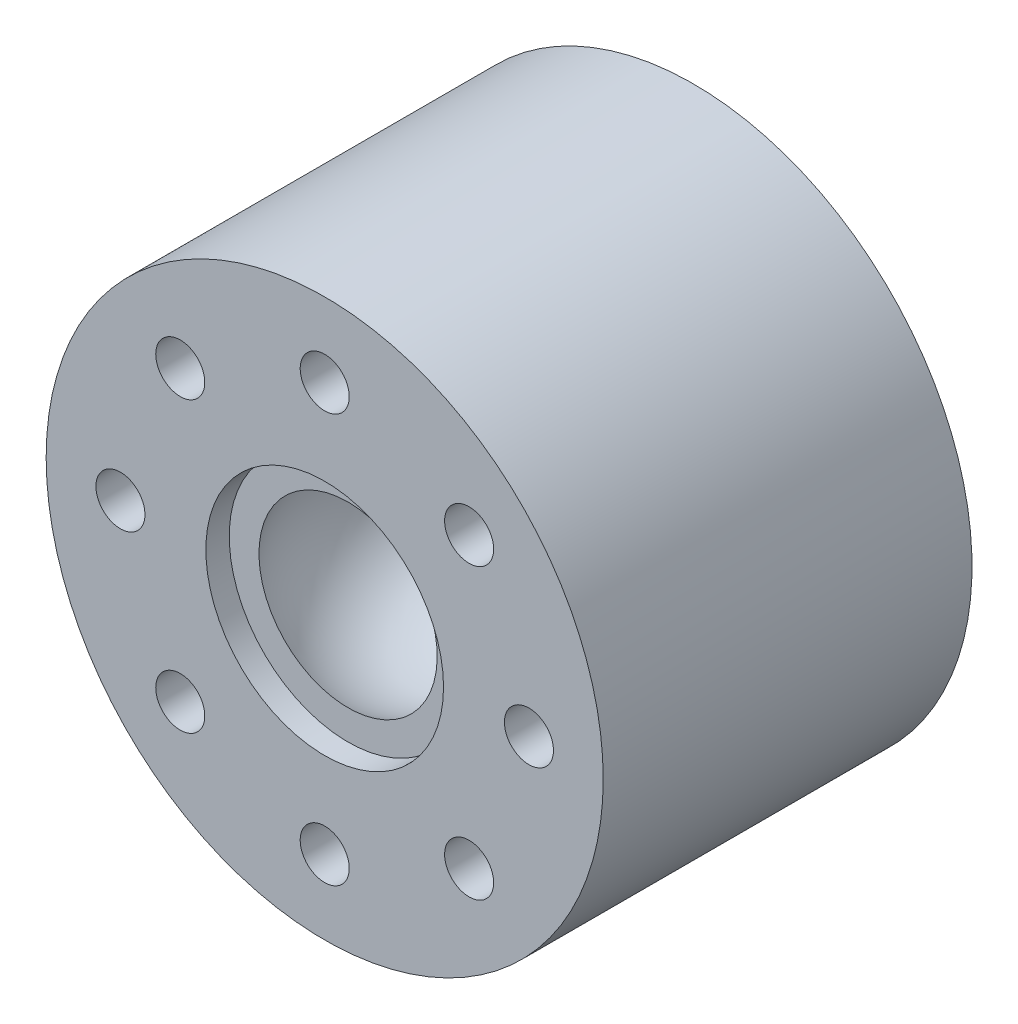
ISO-10303-21;
HEADER;
FILE_DESCRIPTION(('STEP AP214'),'2;1');
FILE_NAME('part.step','',(''),(''),'','','');
FILE_SCHEMA(('AUTOMOTIVE_DESIGN { 1 0 10303 214 1 1 1 1 }'));
ENDSEC;
DATA;
#1=APPLICATION_CONTEXT('core data for automotive mechanical design processes');
#2=APPLICATION_PROTOCOL_DEFINITION('international standard','automotive_design',2000,#1);
#3=PRODUCT_CONTEXT('',#1,'mechanical');
#4=PRODUCT('Part','Part','',(#3));
#5=PRODUCT_RELATED_PRODUCT_CATEGORY('part','',(#4));
#6=PRODUCT_DEFINITION_FORMATION('','',#4);
#7=PRODUCT_DEFINITION_CONTEXT('part definition',#1,'design');
#8=PRODUCT_DEFINITION('design','',#6,#7);
#9=PRODUCT_DEFINITION_SHAPE('','',#8);
#10=(LENGTH_UNIT() NAMED_UNIT(*) SI_UNIT(.MILLI.,.METRE.));
#11=(NAMED_UNIT(*) PLANE_ANGLE_UNIT() SI_UNIT($,.RADIAN.));
#12=(NAMED_UNIT(*) SI_UNIT($,.STERADIAN.) SOLID_ANGLE_UNIT());
#13=UNCERTAINTY_MEASURE_WITH_UNIT(LENGTH_MEASURE(1.E-05),#10,'distance_accuracy_value','');
#14=(GEOMETRIC_REPRESENTATION_CONTEXT(3) GLOBAL_UNCERTAINTY_ASSIGNED_CONTEXT((#13)) GLOBAL_UNIT_ASSIGNED_CONTEXT((#10,
#11,#12)) REPRESENTATION_CONTEXT('',''));
#15=CARTESIAN_POINT('',(0.,0.,0.));
#16=DIRECTION('',(0.,0.,1.));
#17=DIRECTION('',(1.,0.,0.));
#18=AXIS2_PLACEMENT_3D('',#15,#16,#17);
#19=CARTESIAN_POINT('',(0.,0.,55.));
#20=DIRECTION('',(0.,0.,-1.));
#21=DIRECTION('',(-1.,0.,0.));
#22=AXIS2_PLACEMENT_3D('',#19,#20,#21);
#23=CYLINDRICAL_SURFACE('',#22,37.5);
#24=CARTESIAN_POINT('',(0.,0.,39.65));
#25=DIRECTION('',(0.,0.,1.));
#26=DIRECTION('',(1.,0.,0.));
#27=AXIS2_PLACEMENT_3D('',#24,#25,#26);
#28=CIRCLE('',#27,37.5);
#29=CARTESIAN_POINT('',(37.5,0.,39.65));
#30=VERTEX_POINT('',#29);
#31=EDGE_CURVE('E107',#30,#30,#28,.T.);
#32=ORIENTED_EDGE('',*,*,#31,.F.);
#33=EDGE_LOOP('',(#32));
#34=FACE_BOUND('',#33,.T.);
#35=CARTESIAN_POINT('',(0.,0.,-10.));
#36=DIRECTION('',(0.,0.,-1.));
#37=DIRECTION('',(-1.,0.,0.));
#38=AXIS2_PLACEMENT_3D('',#35,#36,#37);
#39=CIRCLE('',#38,37.5);
#40=CARTESIAN_POINT('',(-37.5,0.,-10.));
#41=VERTEX_POINT('',#40);
#42=EDGE_CURVE('E117',#41,#41,#39,.T.);
#43=ORIENTED_EDGE('',*,*,#42,.F.);
#44=EDGE_LOOP('',(#43));
#45=FACE_BOUND('',#44,.T.);
#46=ADVANCED_FACE('F51',(#34,#45),#23,.T.);
#47=CARTESIAN_POINT('',(0.,0.,39.));
#48=DIRECTION('',(0.,0.,1.));
#49=DIRECTION('',(1.,0.,0.));
#50=AXIS2_PLACEMENT_3D('',#47,#48,#49);
#51=CYLINDRICAL_SURFACE('',#50,16.);
#52=CARTESIAN_POINT('',(0.,0.,36.5));
#53=DIRECTION('',(0.,0.,1.));
#54=DIRECTION('',(1.,0.,0.));
#55=AXIS2_PLACEMENT_3D('',#52,#53,#54);
#56=CIRCLE('',#55,16.);
#57=CARTESIAN_POINT('',(16.,0.,36.5));
#58=VERTEX_POINT('',#57);
#59=EDGE_CURVE('E12',#58,#58,#56,.T.);
#60=ORIENTED_EDGE('',*,*,#59,.F.);
#61=EDGE_LOOP('',(#60));
#62=FACE_BOUND('',#61,.T.);
#63=CARTESIAN_POINT('',(0.,0.,39.65));
#64=DIRECTION('',(0.,0.,1.));
#65=DIRECTION('',(1.,0.,0.));
#66=AXIS2_PLACEMENT_3D('',#63,#64,#65);
#67=CIRCLE('',#66,16.);
#68=CARTESIAN_POINT('',(16.,0.,39.65));
#69=VERTEX_POINT('',#68);
#70=EDGE_CURVE('E54',#69,#69,#67,.F.);
#71=ORIENTED_EDGE('',*,*,#70,.F.);
#72=EDGE_LOOP('',(#71));
#73=FACE_BOUND('',#72,.T.);
#74=ADVANCED_FACE('F200',(#62,#73),#51,.F.);
#75=CARTESIAN_POINT('',(0.,0.,36.5));
#76=DIRECTION('',(0.,0.,1.));
#77=DIRECTION('',(1.,0.,0.));
#78=AXIS2_PLACEMENT_3D('',#75,#76,#77);
#79=PLANE('',#78);
#80=CARTESIAN_POINT('',(0.,0.,36.5));
#81=DIRECTION('',(0.,0.,-1.));
#82=DIRECTION('',(0.,1.,0.));
#83=AXIS2_PLACEMENT_3D('',#80,#81,#82);
#84=CIRCLE('',#83,12.);
#85=CARTESIAN_POINT('',(0.,12.,36.5));
#86=VERTEX_POINT('',#85);
#87=EDGE_CURVE('E59',#86,#86,#84,.T.);
#88=ORIENTED_EDGE('',*,*,#87,.T.);
#89=EDGE_LOOP('',(#88));
#90=FACE_BOUND('',#89,.T.);
#91=ORIENTED_EDGE('',*,*,#59,.T.);
#92=EDGE_LOOP('',(#91));
#93=FACE_BOUND('',#92,.T.);
#94=ADVANCED_FACE('F86',(#90,#93),#79,.T.);
#95=CARTESIAN_POINT('',(0.,8.9281,12.7));
#96=CARTESIAN_POINT('',(0.,14.2614689761573,19.1658646264111));
#97=CARTESIAN_POINT('',(0.,16.5234175272132,28.3437453756258));
#98=CARTESIAN_POINT('',(0.,12.,36.5));
#99=B_SPLINE_CURVE_WITH_KNOTS('',3,(#95,#96,#97,#98),.UNSPECIFIED.,.F.,.F.,(4,4),(0.,1.),.UNSPECIFIED.);
#100=CARTESIAN_POINT('',(0.,0.,12.7));
#101=DIRECTION('',(0.,0.,-1.));
#102=AXIS1_PLACEMENT('',#100,#101);
#103=SURFACE_OF_REVOLUTION('',#99,#102);
#104=ORIENTED_EDGE('',*,*,#87,.F.);
#105=EDGE_LOOP('',(#104));
#106=FACE_BOUND('',#105,.T.);
#107=CARTESIAN_POINT('',(0.,0.,12.7));
#108=DIRECTION('',(0.,0.,-1.));
#109=DIRECTION('',(0.,1.,0.));
#110=AXIS2_PLACEMENT_3D('',#107,#108,#109);
#111=CIRCLE('',#110,8.9281);
#112=CARTESIAN_POINT('',(0.,8.9281,12.7));
#113=VERTEX_POINT('',#112);
#114=EDGE_CURVE('E65',#113,#113,#111,.T.);
#115=ORIENTED_EDGE('',*,*,#114,.T.);
#116=EDGE_LOOP('',(#115));
#117=FACE_BOUND('',#116,.T.);
#118=ADVANCED_FACE('F75',(#106,#117),#103,.T.);
#119=CARTESIAN_POINT('',(0.,0.,12.7));
#120=DIRECTION('',(0.,0.,-1.));
#121=DIRECTION('',(-1.,0.,0.));
#122=AXIS2_PLACEMENT_3D('',#119,#120,#121);
#123=CYLINDRICAL_SURFACE('',#122,8.9296875);
#124=ORIENTED_EDGE('',*,*,#114,.F.);
#125=EDGE_LOOP('',(#124));
#126=FACE_BOUND('',#125,.T.);
#127=CARTESIAN_POINT('',(0.,0.,-10.));
#128=DIRECTION('',(0.,0.,-1.));
#129=DIRECTION('',(-1.,0.,0.));
#130=AXIS2_PLACEMENT_3D('',#127,#128,#129);
#131=CIRCLE('',#130,8.9296875);
#132=CARTESIAN_POINT('',(-8.9296875,0.,-10.));
#133=VERTEX_POINT('',#132);
#134=EDGE_CURVE('E147',#133,#133,#131,.T.);
#135=ORIENTED_EDGE('',*,*,#134,.T.);
#136=EDGE_LOOP('',(#135));
#137=FACE_BOUND('',#136,.T.);
#138=ADVANCED_FACE('F85',(#126,#137),#123,.F.);
#139=CARTESIAN_POINT('',(0.,0.,39.65));
#140=DIRECTION('',(0.,0.,1.));
#141=DIRECTION('',(1.,0.,0.));
#142=AXIS2_PLACEMENT_3D('',#139,#140,#141);
#143=PLANE('',#142);
#144=CARTESIAN_POINT('',(-27.5,0.,39.65));
#145=DIRECTION('',(0.,0.,-1.));
#146=DIRECTION('',(-1.,0.,0.));
#147=AXIS2_PLACEMENT_3D('',#144,#145,#146);
#148=CIRCLE('',#147,3.302);
#149=CARTESIAN_POINT('',(-30.802,0.,39.65));
#150=VERTEX_POINT('',#149);
#151=EDGE_CURVE('E111',#150,#150,#148,.T.);
#152=ORIENTED_EDGE('',*,*,#151,.T.);
#153=EDGE_LOOP('',(#152));
#154=FACE_BOUND('',#153,.T.);
#155=CARTESIAN_POINT('',(-19.4454364826301,-19.4454364826301,39.65));
#156=DIRECTION('',(0.,0.,-1.));
#157=DIRECTION('',(-1.,0.,0.));
#158=AXIS2_PLACEMENT_3D('',#155,#156,#157);
#159=CIRCLE('',#158,3.302);
#160=CARTESIAN_POINT('',(-22.7474364826301,-19.4454364826301,39.65));
#161=VERTEX_POINT('',#160);
#162=EDGE_CURVE('E137',#161,#161,#159,.T.);
#163=ORIENTED_EDGE('',*,*,#162,.T.);
#164=EDGE_LOOP('',(#163));
#165=FACE_BOUND('',#164,.T.);
#166=CARTESIAN_POINT('',(0.,-27.5,39.65));
#167=DIRECTION('',(0.,0.,-1.));
#168=DIRECTION('',(-1.,0.,0.));
#169=AXIS2_PLACEMENT_3D('',#166,#167,#168);
#170=CIRCLE('',#169,3.302);
#171=CARTESIAN_POINT('',(-3.302,-27.5,39.65));
#172=VERTEX_POINT('',#171);
#173=EDGE_CURVE('E133',#172,#172,#170,.T.);
#174=ORIENTED_EDGE('',*,*,#173,.T.);
#175=EDGE_LOOP('',(#174));
#176=FACE_BOUND('',#175,.T.);
#177=CARTESIAN_POINT('',(19.4454364826301,-19.4454364826301,39.65));
#178=DIRECTION('',(0.,0.,-1.));
#179=DIRECTION('',(-1.,0.,0.));
#180=AXIS2_PLACEMENT_3D('',#177,#178,#179);
#181=CIRCLE('',#180,3.302);
#182=CARTESIAN_POINT('',(16.1434364826301,-19.4454364826301,39.65));
#183=VERTEX_POINT('',#182);
#184=EDGE_CURVE('E129',#183,#183,#181,.T.);
#185=ORIENTED_EDGE('',*,*,#184,.T.);
#186=EDGE_LOOP('',(#185));
#187=FACE_BOUND('',#186,.T.);
#188=CARTESIAN_POINT('',(27.5,0.,39.65));
#189=DIRECTION('',(0.,0.,-1.));
#190=DIRECTION('',(-1.,0.,0.));
#191=AXIS2_PLACEMENT_3D('',#188,#189,#190);
#192=CIRCLE('',#191,3.302);
#193=CARTESIAN_POINT('',(24.198,0.,39.65));
#194=VERTEX_POINT('',#193);
#195=EDGE_CURVE('E125',#194,#194,#192,.T.);
#196=ORIENTED_EDGE('',*,*,#195,.T.);
#197=EDGE_LOOP('',(#196));
#198=FACE_BOUND('',#197,.T.);
#199=CARTESIAN_POINT('',(19.4454364826301,19.4454364826301,39.65));
#200=DIRECTION('',(0.,0.,-1.));
#201=DIRECTION('',(-1.,0.,0.));
#202=AXIS2_PLACEMENT_3D('',#199,#200,#201);
#203=CIRCLE('',#202,3.302);
#204=CARTESIAN_POINT('',(16.1434364826301,19.4454364826301,39.65));
#205=VERTEX_POINT('',#204);
#206=EDGE_CURVE('E121',#205,#205,#203,.T.);
#207=ORIENTED_EDGE('',*,*,#206,.T.);
#208=EDGE_LOOP('',(#207));
#209=FACE_BOUND('',#208,.T.);
#210=CARTESIAN_POINT('',(0.,27.5,39.65));
#211=DIRECTION('',(0.,0.,-1.));
#212=DIRECTION('',(-1.,0.,0.));
#213=AXIS2_PLACEMENT_3D('',#210,#211,#212);
#214=CIRCLE('',#213,3.302);
#215=CARTESIAN_POINT('',(-3.302,27.5,39.65));
#216=VERTEX_POINT('',#215);
#217=EDGE_CURVE('E116',#216,#216,#214,.T.);
#218=ORIENTED_EDGE('',*,*,#217,.T.);
#219=EDGE_LOOP('',(#218));
#220=FACE_BOUND('',#219,.T.);
#221=CARTESIAN_POINT('',(-19.4454364826301,19.4454364826301,39.65));
#222=DIRECTION('',(0.,0.,-1.));
#223=DIRECTION('',(-1.,0.,0.));
#224=AXIS2_PLACEMENT_3D('',#221,#222,#223);
#225=CIRCLE('',#224,3.302);
#226=CARTESIAN_POINT('',(-22.7474364826301,19.4454364826301,39.65));
#227=VERTEX_POINT('',#226);
#228=EDGE_CURVE('E112',#227,#227,#225,.T.);
#229=ORIENTED_EDGE('',*,*,#228,.T.);
#230=EDGE_LOOP('',(#229));
#231=FACE_BOUND('',#230,.T.);
#232=ORIENTED_EDGE('',*,*,#31,.T.);
#233=EDGE_LOOP('',(#232));
#234=FACE_BOUND('',#233,.T.);
#235=ORIENTED_EDGE('',*,*,#70,.T.);
#236=EDGE_LOOP('',(#235));
#237=FACE_BOUND('',#236,.T.);
#238=ADVANCED_FACE('F222',(#154,#165,#176,#187,#198,#209,#220,#231,#234,#237),#143,.T.);
#239=CARTESIAN_POINT('',(-19.4454364826301,19.4454364826301,39.65));
#240=DIRECTION('',(0.,0.,-1.));
#241=DIRECTION('',(-1.,0.,0.));
#242=AXIS2_PLACEMENT_3D('',#239,#240,#241);
#243=CYLINDRICAL_SURFACE('',#242,3.302);
#244=ORIENTED_EDGE('',*,*,#228,.F.);
#245=EDGE_LOOP('',(#244));
#246=FACE_BOUND('',#245,.T.);
#247=CARTESIAN_POINT('',(-19.4454364826301,19.4454364826301,-10.));
#248=DIRECTION('',(0.,0.,-1.));
#249=DIRECTION('',(-1.,0.,0.));
#250=AXIS2_PLACEMENT_3D('',#247,#248,#249);
#251=CIRCLE('',#250,3.302);
#252=CARTESIAN_POINT('',(-22.7474364826301,19.4454364826301,-10.));
#253=VERTEX_POINT('',#252);
#254=EDGE_CURVE('E171',#253,#253,#251,.T.);
#255=ORIENTED_EDGE('',*,*,#254,.T.);
#256=EDGE_LOOP('',(#255));
#257=FACE_BOUND('',#256,.T.);
#258=ADVANCED_FACE('F219',(#246,#257),#243,.F.);
#259=CARTESIAN_POINT('',(0.,27.5,39.65));
#260=DIRECTION('',(0.,0.,-1.));
#261=DIRECTION('',(-1.,0.,0.));
#262=AXIS2_PLACEMENT_3D('',#259,#260,#261);
#263=CYLINDRICAL_SURFACE('',#262,3.302);
#264=ORIENTED_EDGE('',*,*,#217,.F.);
#265=EDGE_LOOP('',(#264));
#266=FACE_BOUND('',#265,.T.);
#267=CARTESIAN_POINT('',(0.,27.5,-10.));
#268=DIRECTION('',(0.,0.,-1.));
#269=DIRECTION('',(-1.,0.,0.));
#270=AXIS2_PLACEMENT_3D('',#267,#268,#269);
#271=CIRCLE('',#270,3.302);
#272=CARTESIAN_POINT('',(-3.302,27.5,-10.));
#273=VERTEX_POINT('',#272);
#274=EDGE_CURVE('E175',#273,#273,#271,.T.);
#275=ORIENTED_EDGE('',*,*,#274,.T.);
#276=EDGE_LOOP('',(#275));
#277=FACE_BOUND('',#276,.T.);
#278=ADVANCED_FACE('F221',(#266,#277),#263,.F.);
#279=CARTESIAN_POINT('',(19.4454364826301,19.4454364826301,39.65));
#280=DIRECTION('',(0.,0.,-1.));
#281=DIRECTION('',(-1.,0.,0.));
#282=AXIS2_PLACEMENT_3D('',#279,#280,#281);
#283=CYLINDRICAL_SURFACE('',#282,3.302);
#284=ORIENTED_EDGE('',*,*,#206,.F.);
#285=EDGE_LOOP('',(#284));
#286=FACE_BOUND('',#285,.T.);
#287=CARTESIAN_POINT('',(19.4454364826301,19.4454364826301,-10.));
#288=DIRECTION('',(0.,0.,-1.));
#289=DIRECTION('',(-1.,0.,0.));
#290=AXIS2_PLACEMENT_3D('',#287,#288,#289);
#291=CIRCLE('',#290,3.302);
#292=CARTESIAN_POINT('',(16.1434364826301,19.4454364826301,-10.));
#293=VERTEX_POINT('',#292);
#294=EDGE_CURVE('E179',#293,#293,#291,.T.);
#295=ORIENTED_EDGE('',*,*,#294,.T.);
#296=EDGE_LOOP('',(#295));
#297=FACE_BOUND('',#296,.T.);
#298=ADVANCED_FACE('F184',(#286,#297),#283,.F.);
#299=CARTESIAN_POINT('',(27.5,0.,39.65));
#300=DIRECTION('',(0.,0.,-1.));
#301=DIRECTION('',(-1.,0.,0.));
#302=AXIS2_PLACEMENT_3D('',#299,#300,#301);
#303=CYLINDRICAL_SURFACE('',#302,3.302);
#304=ORIENTED_EDGE('',*,*,#195,.F.);
#305=EDGE_LOOP('',(#304));
#306=FACE_BOUND('',#305,.T.);
#307=CARTESIAN_POINT('',(27.5,0.,-10.));
#308=DIRECTION('',(0.,0.,-1.));
#309=DIRECTION('',(-1.,0.,0.));
#310=AXIS2_PLACEMENT_3D('',#307,#308,#309);
#311=CIRCLE('',#310,3.302);
#312=CARTESIAN_POINT('',(24.198,0.,-10.));
#313=VERTEX_POINT('',#312);
#314=EDGE_CURVE('E151',#313,#313,#311,.T.);
#315=ORIENTED_EDGE('',*,*,#314,.T.);
#316=EDGE_LOOP('',(#315));
#317=FACE_BOUND('',#316,.T.);
#318=ADVANCED_FACE('F236',(#306,#317),#303,.F.);
#319=CARTESIAN_POINT('',(19.4454364826301,-19.4454364826301,39.65));
#320=DIRECTION('',(0.,0.,-1.));
#321=DIRECTION('',(-1.,0.,0.));
#322=AXIS2_PLACEMENT_3D('',#319,#320,#321);
#323=CYLINDRICAL_SURFACE('',#322,3.302);
#324=ORIENTED_EDGE('',*,*,#184,.F.);
#325=EDGE_LOOP('',(#324));
#326=FACE_BOUND('',#325,.T.);
#327=CARTESIAN_POINT('',(19.4454364826301,-19.4454364826301,-10.));
#328=DIRECTION('',(0.,0.,-1.));
#329=DIRECTION('',(-1.,0.,0.));
#330=AXIS2_PLACEMENT_3D('',#327,#328,#329);
#331=CIRCLE('',#330,3.302);
#332=CARTESIAN_POINT('',(16.1434364826301,-19.4454364826301,-10.));
#333=VERTEX_POINT('',#332);
#334=EDGE_CURVE('E155',#333,#333,#331,.T.);
#335=ORIENTED_EDGE('',*,*,#334,.T.);
#336=EDGE_LOOP('',(#335));
#337=FACE_BOUND('',#336,.T.);
#338=ADVANCED_FACE('F240',(#326,#337),#323,.F.);
#339=CARTESIAN_POINT('',(0.,-27.5,39.65));
#340=DIRECTION('',(0.,0.,-1.));
#341=DIRECTION('',(-1.,0.,0.));
#342=AXIS2_PLACEMENT_3D('',#339,#340,#341);
#343=CYLINDRICAL_SURFACE('',#342,3.302);
#344=ORIENTED_EDGE('',*,*,#173,.F.);
#345=EDGE_LOOP('',(#344));
#346=FACE_BOUND('',#345,.T.);
#347=CARTESIAN_POINT('',(0.,-27.5,-10.));
#348=DIRECTION('',(0.,0.,-1.));
#349=DIRECTION('',(-1.,0.,0.));
#350=AXIS2_PLACEMENT_3D('',#347,#348,#349);
#351=CIRCLE('',#350,3.302);
#352=CARTESIAN_POINT('',(-3.302,-27.5,-10.));
#353=VERTEX_POINT('',#352);
#354=EDGE_CURVE('E159',#353,#353,#351,.T.);
#355=ORIENTED_EDGE('',*,*,#354,.T.);
#356=EDGE_LOOP('',(#355));
#357=FACE_BOUND('',#356,.T.);
#358=ADVANCED_FACE('F244',(#346,#357),#343,.F.);
#359=CARTESIAN_POINT('',(-19.4454364826301,-19.4454364826301,39.65));
#360=DIRECTION('',(0.,0.,-1.));
#361=DIRECTION('',(-1.,0.,0.));
#362=AXIS2_PLACEMENT_3D('',#359,#360,#361);
#363=CYLINDRICAL_SURFACE('',#362,3.302);
#364=ORIENTED_EDGE('',*,*,#162,.F.);
#365=EDGE_LOOP('',(#364));
#366=FACE_BOUND('',#365,.T.);
#367=CARTESIAN_POINT('',(-19.4454364826301,-19.4454364826301,-10.));
#368=DIRECTION('',(0.,0.,-1.));
#369=DIRECTION('',(-1.,0.,0.));
#370=AXIS2_PLACEMENT_3D('',#367,#368,#369);
#371=CIRCLE('',#370,3.302);
#372=CARTESIAN_POINT('',(-22.7474364826301,-19.4454364826301,-10.));
#373=VERTEX_POINT('',#372);
#374=EDGE_CURVE('E163',#373,#373,#371,.T.);
#375=ORIENTED_EDGE('',*,*,#374,.T.);
#376=EDGE_LOOP('',(#375));
#377=FACE_BOUND('',#376,.T.);
#378=ADVANCED_FACE('F194',(#366,#377),#363,.F.);
#379=CARTESIAN_POINT('',(-27.5,0.,39.65));
#380=DIRECTION('',(0.,0.,-1.));
#381=DIRECTION('',(-1.,0.,0.));
#382=AXIS2_PLACEMENT_3D('',#379,#380,#381);
#383=CYLINDRICAL_SURFACE('',#382,3.302);
#384=ORIENTED_EDGE('',*,*,#151,.F.);
#385=EDGE_LOOP('',(#384));
#386=FACE_BOUND('',#385,.T.);
#387=CARTESIAN_POINT('',(-27.5,0.,-10.));
#388=DIRECTION('',(0.,0.,-1.));
#389=DIRECTION('',(-1.,0.,0.));
#390=AXIS2_PLACEMENT_3D('',#387,#388,#389);
#391=CIRCLE('',#390,3.302);
#392=CARTESIAN_POINT('',(-30.802,0.,-10.));
#393=VERTEX_POINT('',#392);
#394=EDGE_CURVE('E167',#393,#393,#391,.T.);
#395=ORIENTED_EDGE('',*,*,#394,.T.);
#396=EDGE_LOOP('',(#395));
#397=FACE_BOUND('',#396,.T.);
#398=ADVANCED_FACE('F188',(#386,#397),#383,.F.);
#399=CARTESIAN_POINT('',(0.,0.,-10.));
#400=DIRECTION('',(0.,0.,-1.));
#401=DIRECTION('',(-1.,0.,0.));
#402=AXIS2_PLACEMENT_3D('',#399,#400,#401);
#403=PLANE('',#402);
#404=ORIENTED_EDGE('',*,*,#274,.F.);
#405=EDGE_LOOP('',(#404));
#406=FACE_BOUND('',#405,.T.);
#407=ORIENTED_EDGE('',*,*,#394,.F.);
#408=EDGE_LOOP('',(#407));
#409=FACE_BOUND('',#408,.T.);
#410=ORIENTED_EDGE('',*,*,#354,.F.);
#411=EDGE_LOOP('',(#410));
#412=FACE_BOUND('',#411,.T.);
#413=ORIENTED_EDGE('',*,*,#314,.F.);
#414=EDGE_LOOP('',(#413));
#415=FACE_BOUND('',#414,.T.);
#416=ORIENTED_EDGE('',*,*,#42,.T.);
#417=EDGE_LOOP('',(#416));
#418=FACE_BOUND('',#417,.T.);
#419=ORIENTED_EDGE('',*,*,#134,.F.);
#420=EDGE_LOOP('',(#419));
#421=FACE_BOUND('',#420,.T.);
#422=ORIENTED_EDGE('',*,*,#334,.F.);
#423=EDGE_LOOP('',(#422));
#424=FACE_BOUND('',#423,.T.);
#425=ORIENTED_EDGE('',*,*,#374,.F.);
#426=EDGE_LOOP('',(#425));
#427=FACE_BOUND('',#426,.T.);
#428=ORIENTED_EDGE('',*,*,#254,.F.);
#429=EDGE_LOOP('',(#428));
#430=FACE_BOUND('',#429,.T.);
#431=ORIENTED_EDGE('',*,*,#294,.F.);
#432=EDGE_LOOP('',(#431));
#433=FACE_BOUND('',#432,.T.);
#434=ADVANCED_FACE('F186',(#406,#409,#412,#415,#418,#421,#424,#427,#430,#433),#403,.T.);
#435=CLOSED_SHELL('',(#46,#74,#94,#118,#138,#238,#258,#278,#298,#318,#338,#358,#378,#398,#434));
#436=MANIFOLD_SOLID_BREP('B2',#435);
#437=ADVANCED_BREP_SHAPE_REPRESENTATION('',(#18,#436),#14);
#438=SHAPE_DEFINITION_REPRESENTATION(#9,#437);
ENDSEC;
END-ISO-10303-21;
